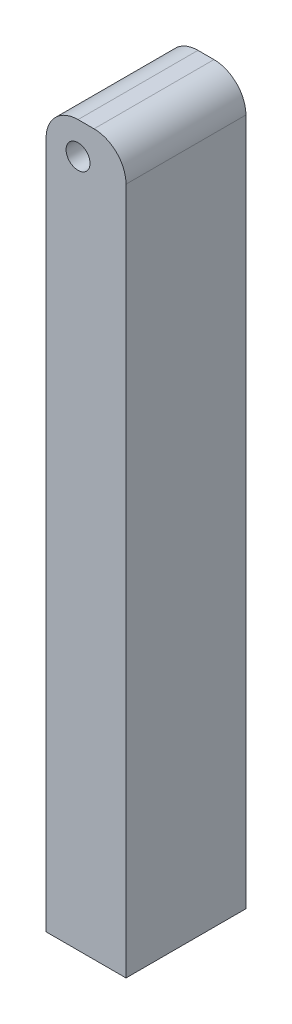
ISO-10303-21;
HEADER;
FILE_DESCRIPTION(('STEP AP214'),'2;1');
FILE_NAME('part.step','',(''),(''),'','','');
FILE_SCHEMA(('AUTOMOTIVE_DESIGN { 1 0 10303 214 1 1 1 1 }'));
ENDSEC;
DATA;
#1=APPLICATION_CONTEXT('core data for automotive mechanical design processes');
#2=APPLICATION_PROTOCOL_DEFINITION('international standard','automotive_design',2000,#1);
#3=PRODUCT_CONTEXT('',#1,'mechanical');
#4=PRODUCT('Part','Part','',(#3));
#5=PRODUCT_RELATED_PRODUCT_CATEGORY('part','',(#4));
#6=PRODUCT_DEFINITION_FORMATION('','',#4);
#7=PRODUCT_DEFINITION_CONTEXT('part definition',#1,'design');
#8=PRODUCT_DEFINITION('design','',#6,#7);
#9=PRODUCT_DEFINITION_SHAPE('','',#8);
#10=(LENGTH_UNIT() NAMED_UNIT(*) SI_UNIT(.MILLI.,.METRE.));
#11=(NAMED_UNIT(*) PLANE_ANGLE_UNIT() SI_UNIT($,.RADIAN.));
#12=(NAMED_UNIT(*) SI_UNIT($,.STERADIAN.) SOLID_ANGLE_UNIT());
#13=UNCERTAINTY_MEASURE_WITH_UNIT(LENGTH_MEASURE(1.E-05),#10,'distance_accuracy_value','');
#14=(GEOMETRIC_REPRESENTATION_CONTEXT(3) GLOBAL_UNCERTAINTY_ASSIGNED_CONTEXT((#13)) GLOBAL_UNIT_ASSIGNED_CONTEXT((#10,
#11,#12)) REPRESENTATION_CONTEXT('',''));
#15=CARTESIAN_POINT('',(0.,0.,0.));
#16=DIRECTION('',(0.,0.,1.));
#17=DIRECTION('',(1.,0.,0.));
#18=AXIS2_PLACEMENT_3D('',#15,#16,#17);
#19=CARTESIAN_POINT('',(8.,-8.,15.));
#20=DIRECTION('',(0.,0.,1.));
#21=DIRECTION('',(1.,0.,0.));
#22=AXIS2_PLACEMENT_3D('',#19,#20,#21);
#23=PLANE('',#22);
#24=DIRECTION('',(0.,1.,0.));
#25=VECTOR('',#24,1.);
#26=CARTESIAN_POINT('',(20.,-8.,15.));
#27=LINE('',#26,#25);
#28=CARTESIAN_POINT('',(20.,-180.,15.));
#29=VERTEX_POINT('',#28);
#30=CARTESIAN_POINT('',(20.,-7.99999999999999,15.));
#31=VERTEX_POINT('',#30);
#32=EDGE_CURVE('E135',#29,#31,#27,.T.);
#33=ORIENTED_EDGE('',*,*,#32,.T.);
#34=CARTESIAN_POINT('',(12.,-8.,15.));
#35=DIRECTION('',(0.,0.,1.));
#36=DIRECTION('',(-1.,0.,0.));
#37=AXIS2_PLACEMENT_3D('',#34,#35,#36);
#38=CIRCLE('',#37,8.);
#39=CARTESIAN_POINT('',(12.,0.,15.));
#40=VERTEX_POINT('',#39);
#41=EDGE_CURVE('E93',#31,#40,#38,.T.);
#42=ORIENTED_EDGE('',*,*,#41,.T.);
#43=DIRECTION('',(-1.,0.,0.));
#44=VECTOR('',#43,1.);
#45=CARTESIAN_POINT('',(8.,0.,15.));
#46=LINE('',#45,#44);
#47=CARTESIAN_POINT('',(8.,0.,15.));
#48=VERTEX_POINT('',#47);
#49=EDGE_CURVE('E106',#40,#48,#46,.T.);
#50=ORIENTED_EDGE('',*,*,#49,.T.);
#51=CARTESIAN_POINT('',(8.,-8.,15.));
#52=DIRECTION('',(0.,0.,1.));
#53=DIRECTION('',(1.,0.,0.));
#54=AXIS2_PLACEMENT_3D('',#51,#52,#53);
#55=CIRCLE('',#54,8.);
#56=CARTESIAN_POINT('',(0.,-8.,15.));
#57=VERTEX_POINT('',#56);
#58=EDGE_CURVE('E100',#48,#57,#55,.T.);
#59=ORIENTED_EDGE('',*,*,#58,.T.);
#60=DIRECTION('',(0.,-1.,0.));
#61=VECTOR('',#60,1.);
#62=CARTESIAN_POINT('',(0.,-8.,15.));
#63=LINE('',#62,#61);
#64=CARTESIAN_POINT('',(0.,-180.,15.));
#65=VERTEX_POINT('',#64);
#66=EDGE_CURVE('E104',#57,#65,#63,.T.);
#67=ORIENTED_EDGE('',*,*,#66,.T.);
#68=DIRECTION('',(1.,0.,0.));
#69=VECTOR('',#68,1.);
#70=CARTESIAN_POINT('',(0.,-180.,15.));
#71=LINE('',#70,#69);
#72=EDGE_CURVE('E56',#65,#29,#71,.T.);
#73=ORIENTED_EDGE('',*,*,#72,.T.);
#74=EDGE_LOOP('',(#33,#42,#50,#59,#67,#73));
#75=FACE_BOUND('',#74,.T.);
#76=CARTESIAN_POINT('',(8.,-8.,15.));
#77=DIRECTION('',(0.,0.,1.));
#78=DIRECTION('',(1.,0.,0.));
#79=AXIS2_PLACEMENT_3D('',#76,#77,#78);
#80=CIRCLE('',#79,3.);
#81=CARTESIAN_POINT('',(11.,-8.,15.));
#82=VERTEX_POINT('',#81);
#83=EDGE_CURVE('E128',#82,#82,#80,.T.);
#84=ORIENTED_EDGE('',*,*,#83,.F.);
#85=EDGE_LOOP('',(#84));
#86=FACE_BOUND('',#85,.T.);
#87=ADVANCED_FACE('F39',(#75,#86),#23,.T.);
#88=CARTESIAN_POINT('',(8.,-8.,-15.));
#89=DIRECTION('',(0.,0.,1.));
#90=DIRECTION('',(1.,0.,0.));
#91=AXIS2_PLACEMENT_3D('',#88,#89,#90);
#92=PLANE('',#91);
#93=DIRECTION('',(0.,1.,0.));
#94=VECTOR('',#93,1.);
#95=CARTESIAN_POINT('',(20.,-8.,-15.));
#96=LINE('',#95,#94);
#97=CARTESIAN_POINT('',(20.,-180.,-15.));
#98=VERTEX_POINT('',#97);
#99=CARTESIAN_POINT('',(20.,-7.99999999999999,-15.));
#100=VERTEX_POINT('',#99);
#101=EDGE_CURVE('E124',#98,#100,#96,.T.);
#102=ORIENTED_EDGE('',*,*,#101,.F.);
#103=DIRECTION('',(1.,0.,0.));
#104=VECTOR('',#103,1.);
#105=CARTESIAN_POINT('',(0.,-180.,-15.));
#106=LINE('',#105,#104);
#107=CARTESIAN_POINT('',(0.,-180.,-15.));
#108=VERTEX_POINT('',#107);
#109=EDGE_CURVE('E85',#108,#98,#106,.T.);
#110=ORIENTED_EDGE('',*,*,#109,.F.);
#111=DIRECTION('',(0.,-1.,0.));
#112=VECTOR('',#111,1.);
#113=CARTESIAN_POINT('',(0.,-8.,-15.));
#114=LINE('',#113,#112);
#115=CARTESIAN_POINT('',(0.,-8.,-15.));
#116=VERTEX_POINT('',#115);
#117=EDGE_CURVE('E79',#116,#108,#114,.T.);
#118=ORIENTED_EDGE('',*,*,#117,.F.);
#119=CARTESIAN_POINT('',(8.,-8.,-15.));
#120=DIRECTION('',(0.,0.,1.));
#121=DIRECTION('',(1.,0.,0.));
#122=AXIS2_PLACEMENT_3D('',#119,#120,#121);
#123=CIRCLE('',#122,8.);
#124=CARTESIAN_POINT('',(8.,0.,-15.));
#125=VERTEX_POINT('',#124);
#126=EDGE_CURVE('E114',#125,#116,#123,.T.);
#127=ORIENTED_EDGE('',*,*,#126,.F.);
#128=DIRECTION('',(-1.,0.,0.));
#129=VECTOR('',#128,1.);
#130=CARTESIAN_POINT('',(8.,0.,-15.));
#131=LINE('',#130,#129);
#132=CARTESIAN_POINT('',(12.,0.,-15.));
#133=VERTEX_POINT('',#132);
#134=EDGE_CURVE('E130',#133,#125,#131,.T.);
#135=ORIENTED_EDGE('',*,*,#134,.F.);
#136=CARTESIAN_POINT('',(12.,-8.,-15.));
#137=DIRECTION('',(0.,0.,1.));
#138=DIRECTION('',(-1.,0.,0.));
#139=AXIS2_PLACEMENT_3D('',#136,#137,#138);
#140=CIRCLE('',#139,8.);
#141=EDGE_CURVE('E127',#100,#133,#140,.T.);
#142=ORIENTED_EDGE('',*,*,#141,.F.);
#143=EDGE_LOOP('',(#102,#110,#118,#127,#135,#142));
#144=FACE_BOUND('',#143,.T.);
#145=CARTESIAN_POINT('',(8.,-8.,-15.));
#146=DIRECTION('',(0.,0.,1.));
#147=DIRECTION('',(1.,0.,0.));
#148=AXIS2_PLACEMENT_3D('',#145,#146,#147);
#149=CIRCLE('',#148,3.);
#150=CARTESIAN_POINT('',(11.,-8.,-15.));
#151=VERTEX_POINT('',#150);
#152=EDGE_CURVE('E181',#151,#151,#149,.T.);
#153=ORIENTED_EDGE('',*,*,#152,.T.);
#154=EDGE_LOOP('',(#153));
#155=FACE_BOUND('',#154,.T.);
#156=ADVANCED_FACE('F144',(#144,#155),#92,.F.);
#157=CARTESIAN_POINT('',(20.,-8.,15.));
#158=DIRECTION('',(-1.,0.,0.));
#159=DIRECTION('',(0.,-1.,0.));
#160=AXIS2_PLACEMENT_3D('',#157,#158,#159);
#161=PLANE('',#160);
#162=ORIENTED_EDGE('',*,*,#101,.T.);
#163=DIRECTION('',(0.,0.,-1.));
#164=VECTOR('',#163,1.);
#165=CARTESIAN_POINT('',(20.,-7.99999999999999,15.));
#166=LINE('',#165,#164);
#167=EDGE_CURVE('E11',#31,#100,#166,.T.);
#168=ORIENTED_EDGE('',*,*,#167,.F.);
#169=ORIENTED_EDGE('',*,*,#32,.F.);
#170=DIRECTION('',(0.,0.,-1.));
#171=VECTOR('',#170,1.);
#172=CARTESIAN_POINT('',(20.,-180.,15.));
#173=LINE('',#172,#171);
#174=EDGE_CURVE('E120',#29,#98,#173,.T.);
#175=ORIENTED_EDGE('',*,*,#174,.T.);
#176=EDGE_LOOP('',(#162,#168,#169,#175));
#177=FACE_BOUND('',#176,.T.);
#178=ADVANCED_FACE('F41',(#177),#161,.F.);
#179=CARTESIAN_POINT('',(12.,-8.,15.));
#180=DIRECTION('',(0.,0.,-1.));
#181=DIRECTION('',(-1.,0.,0.));
#182=AXIS2_PLACEMENT_3D('',#179,#180,#181);
#183=CYLINDRICAL_SURFACE('',#182,8.);
#184=ORIENTED_EDGE('',*,*,#141,.T.);
#185=DIRECTION('',(0.,0.,-1.));
#186=VECTOR('',#185,1.);
#187=CARTESIAN_POINT('',(12.,0.,15.));
#188=LINE('',#187,#186);
#189=EDGE_CURVE('E48',#40,#133,#188,.T.);
#190=ORIENTED_EDGE('',*,*,#189,.F.);
#191=ORIENTED_EDGE('',*,*,#41,.F.);
#192=ORIENTED_EDGE('',*,*,#167,.T.);
#193=EDGE_LOOP('',(#184,#190,#191,#192));
#194=FACE_BOUND('',#193,.T.);
#195=ADVANCED_FACE('F235',(#194),#183,.T.);
#196=CARTESIAN_POINT('',(8.,0.,15.));
#197=DIRECTION('',(0.,-1.,0.));
#198=DIRECTION('',(1.,0.,0.));
#199=AXIS2_PLACEMENT_3D('',#196,#197,#198);
#200=PLANE('',#199);
#201=ORIENTED_EDGE('',*,*,#134,.T.);
#202=DIRECTION('',(0.,0.,-1.));
#203=VECTOR('',#202,1.);
#204=CARTESIAN_POINT('',(8.,0.,15.));
#205=LINE('',#204,#203);
#206=EDGE_CURVE('E115',#48,#125,#205,.T.);
#207=ORIENTED_EDGE('',*,*,#206,.F.);
#208=ORIENTED_EDGE('',*,*,#49,.F.);
#209=ORIENTED_EDGE('',*,*,#189,.T.);
#210=EDGE_LOOP('',(#201,#207,#208,#209));
#211=FACE_BOUND('',#210,.T.);
#212=ADVANCED_FACE('F141',(#211),#200,.F.);
#213=CARTESIAN_POINT('',(8.,-8.,15.));
#214=DIRECTION('',(0.,0.,-1.));
#215=DIRECTION('',(-1.,0.,0.));
#216=AXIS2_PLACEMENT_3D('',#213,#214,#215);
#217=CYLINDRICAL_SURFACE('',#216,8.);
#218=ORIENTED_EDGE('',*,*,#126,.T.);
#219=DIRECTION('',(0.,0.,-1.));
#220=VECTOR('',#219,1.);
#221=CARTESIAN_POINT('',(0.,-8.,15.));
#222=LINE('',#221,#220);
#223=EDGE_CURVE('E111',#57,#116,#222,.T.);
#224=ORIENTED_EDGE('',*,*,#223,.F.);
#225=ORIENTED_EDGE('',*,*,#58,.F.);
#226=ORIENTED_EDGE('',*,*,#206,.T.);
#227=EDGE_LOOP('',(#218,#224,#225,#226));
#228=FACE_BOUND('',#227,.T.);
#229=ADVANCED_FACE('F112',(#228),#217,.T.);
#230=CARTESIAN_POINT('',(0.,-8.,15.));
#231=DIRECTION('',(1.,0.,0.));
#232=DIRECTION('',(0.,1.,0.));
#233=AXIS2_PLACEMENT_3D('',#230,#231,#232);
#234=PLANE('',#233);
#235=ORIENTED_EDGE('',*,*,#117,.T.);
#236=DIRECTION('',(0.,0.,-1.));
#237=VECTOR('',#236,1.);
#238=CARTESIAN_POINT('',(0.,-180.,15.));
#239=LINE('',#238,#237);
#240=EDGE_CURVE('E116',#65,#108,#239,.T.);
#241=ORIENTED_EDGE('',*,*,#240,.F.);
#242=ORIENTED_EDGE('',*,*,#66,.F.);
#243=ORIENTED_EDGE('',*,*,#223,.T.);
#244=EDGE_LOOP('',(#235,#241,#242,#243));
#245=FACE_BOUND('',#244,.T.);
#246=ADVANCED_FACE('F118',(#245),#234,.F.);
#247=CARTESIAN_POINT('',(0.,-180.,15.));
#248=DIRECTION('',(0.,1.,0.));
#249=DIRECTION('',(0.,0.,1.));
#250=AXIS2_PLACEMENT_3D('',#247,#248,#249);
#251=PLANE('',#250);
#252=CARTESIAN_POINT('',(10.,-180.,0.));
#253=DIRECTION('',(0.,-1.,0.));
#254=DIRECTION('',(0.,0.,-1.));
#255=AXIS2_PLACEMENT_3D('',#252,#253,#254);
#256=CIRCLE('',#255,5.);
#257=CARTESIAN_POINT('',(10.,-180.,-5.));
#258=VERTEX_POINT('',#257);
#259=EDGE_CURVE('E182',#258,#258,#256,.T.);
#260=ORIENTED_EDGE('',*,*,#259,.F.);
#261=EDGE_LOOP('',(#260));
#262=FACE_BOUND('',#261,.T.);
#263=ORIENTED_EDGE('',*,*,#109,.T.);
#264=ORIENTED_EDGE('',*,*,#174,.F.);
#265=ORIENTED_EDGE('',*,*,#72,.F.);
#266=ORIENTED_EDGE('',*,*,#240,.T.);
#267=EDGE_LOOP('',(#263,#264,#265,#266));
#268=FACE_BOUND('',#267,.T.);
#269=ADVANCED_FACE('F149',(#262,#268),#251,.F.);
#270=CARTESIAN_POINT('',(8.,-8.,15.));
#271=DIRECTION('',(0.,0.,-1.));
#272=DIRECTION('',(-1.,0.,0.));
#273=AXIS2_PLACEMENT_3D('',#270,#271,#272);
#274=CYLINDRICAL_SURFACE('',#273,3.);
#275=ORIENTED_EDGE('',*,*,#83,.T.);
#276=EDGE_LOOP('',(#275));
#277=FACE_BOUND('',#276,.T.);
#278=ORIENTED_EDGE('',*,*,#152,.F.);
#279=EDGE_LOOP('',(#278));
#280=FACE_BOUND('',#279,.T.);
#281=ADVANCED_FACE('F151',(#277,#280),#274,.F.);
#282=CARTESIAN_POINT('',(10.,-150.,0.));
#283=DIRECTION('',(0.,-1.,0.));
#284=DIRECTION('',(0.,0.,-1.));
#285=AXIS2_PLACEMENT_3D('',#282,#283,#284);
#286=CYLINDRICAL_SURFACE('',#285,5.);
#287=CARTESIAN_POINT('',(10.,-150.,0.));
#288=DIRECTION('',(0.,-1.,0.));
#289=DIRECTION('',(0.,0.,-1.));
#290=AXIS2_PLACEMENT_3D('',#287,#288,#289);
#291=CIRCLE('',#290,5.);
#292=CARTESIAN_POINT('',(10.,-150.,-5.));
#293=VERTEX_POINT('',#292);
#294=EDGE_CURVE('E180',#293,#293,#291,.T.);
#295=ORIENTED_EDGE('',*,*,#294,.F.);
#296=EDGE_LOOP('',(#295));
#297=FACE_BOUND('',#296,.T.);
#298=ORIENTED_EDGE('',*,*,#259,.T.);
#299=EDGE_LOOP('',(#298));
#300=FACE_BOUND('',#299,.T.);
#301=ADVANCED_FACE('F158',(#297,#300),#286,.F.);
#302=CARTESIAN_POINT('',(10.,-150.,0.));
#303=DIRECTION('',(0.,-1.,0.));
#304=DIRECTION('',(0.,0.,-1.));
#305=AXIS2_PLACEMENT_3D('',#302,#303,#304);
#306=PLANE('',#305);
#307=ORIENTED_EDGE('',*,*,#294,.T.);
#308=EDGE_LOOP('',(#307));
#309=FACE_BOUND('',#308,.T.);
#310=ADVANCED_FACE('F172',(#309),#306,.T.);
#311=CLOSED_SHELL('',(#87,#156,#178,#195,#212,#229,#246,#269,#281,#301,#310));
#312=MANIFOLD_SOLID_BREP('B2',#311);
#313=ADVANCED_BREP_SHAPE_REPRESENTATION('',(#18,#312),#14);
#314=SHAPE_DEFINITION_REPRESENTATION(#9,#313);
ENDSEC;
END-ISO-10303-21;
